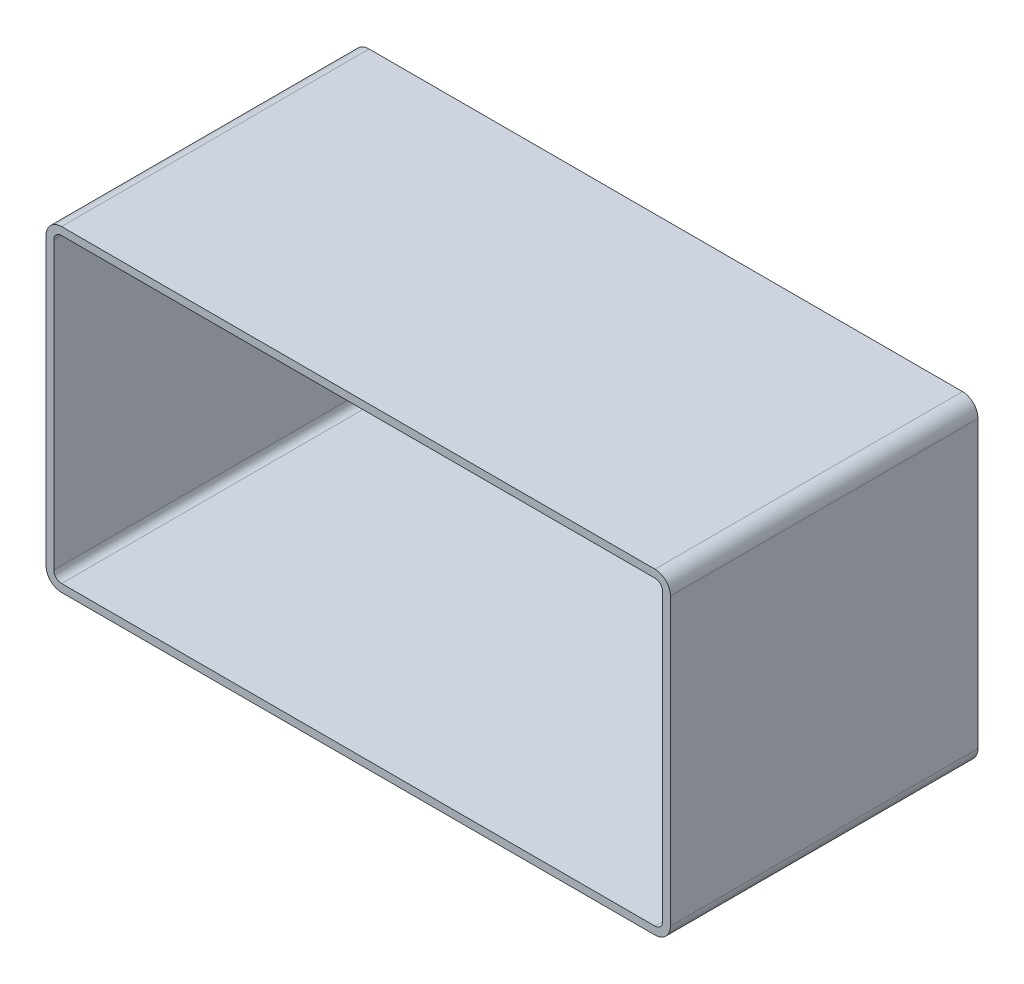
ISO-10303-21;
HEADER;
FILE_DESCRIPTION(('STEP AP214'),'2;1');
FILE_NAME('part.step','',(''),(''),'','','');
FILE_SCHEMA(('AUTOMOTIVE_DESIGN { 1 0 10303 214 1 1 1 1 }'));
ENDSEC;
DATA;
#1=APPLICATION_CONTEXT('core data for automotive mechanical design processes');
#2=APPLICATION_PROTOCOL_DEFINITION('international standard','automotive_design',2000,#1);
#3=PRODUCT_CONTEXT('',#1,'mechanical');
#4=PRODUCT('Part','Part','',(#3));
#5=PRODUCT_RELATED_PRODUCT_CATEGORY('part','',(#4));
#6=PRODUCT_DEFINITION_FORMATION('','',#4);
#7=PRODUCT_DEFINITION_CONTEXT('part definition',#1,'design');
#8=PRODUCT_DEFINITION('design','',#6,#7);
#9=PRODUCT_DEFINITION_SHAPE('','',#8);
#10=(LENGTH_UNIT() NAMED_UNIT(*) SI_UNIT(.MILLI.,.METRE.));
#11=(NAMED_UNIT(*) PLANE_ANGLE_UNIT() SI_UNIT($,.RADIAN.));
#12=(NAMED_UNIT(*) SI_UNIT($,.STERADIAN.) SOLID_ANGLE_UNIT());
#13=UNCERTAINTY_MEASURE_WITH_UNIT(LENGTH_MEASURE(1.E-05),#10,'distance_accuracy_value','');
#14=(GEOMETRIC_REPRESENTATION_CONTEXT(3) GLOBAL_UNCERTAINTY_ASSIGNED_CONTEXT((#13)) GLOBAL_UNIT_ASSIGNED_CONTEXT((#10,
#11,#12)) REPRESENTATION_CONTEXT('',''));
#15=CARTESIAN_POINT('',(0.,0.,0.));
#16=DIRECTION('',(0.,0.,1.));
#17=DIRECTION('',(1.,0.,0.));
#18=AXIS2_PLACEMENT_3D('',#15,#16,#17);
#19=CARTESIAN_POINT('',(-9.1,-9.2,-82.8799290150284));
#20=DIRECTION('',(0.,0.,1.));
#21=DIRECTION('',(1.,0.,0.));
#22=AXIS2_PLACEMENT_3D('',#19,#20,#21);
#23=CYLINDRICAL_SURFACE('',#22,0.999999999999999);
#24=DIRECTION('',(0.,0.,1.));
#25=VECTOR('',#24,1.);
#26=CARTESIAN_POINT('',(-10.1,-9.2,-82.8799290150284));
#27=LINE('',#26,#25);
#28=CARTESIAN_POINT('',(-10.1,-9.2,-37.7));
#29=VERTEX_POINT('',#28);
#30=CARTESIAN_POINT('',(-10.1,-9.2,-17.9));
#31=VERTEX_POINT('',#30);
#32=EDGE_CURVE('E132',#29,#31,#27,.T.);
#33=ORIENTED_EDGE('',*,*,#32,.F.);
#34=CARTESIAN_POINT('',(-9.1,-9.2,-37.7));
#35=DIRECTION('',(0.,0.,1.));
#36=DIRECTION('',(1.,0.,0.));
#37=AXIS2_PLACEMENT_3D('',#34,#35,#36);
#38=CIRCLE('',#37,0.999999999999999);
#39=CARTESIAN_POINT('',(-9.1,-10.2,-37.7));
#40=VERTEX_POINT('',#39);
#41=EDGE_CURVE('E137',#29,#40,#38,.T.);
#42=ORIENTED_EDGE('',*,*,#41,.T.);
#43=DIRECTION('',(0.,0.,1.));
#44=VECTOR('',#43,1.);
#45=CARTESIAN_POINT('',(-9.1,-10.2,-82.8799290150284));
#46=LINE('',#45,#44);
#47=CARTESIAN_POINT('',(-9.1,-10.2,-17.9));
#48=VERTEX_POINT('',#47);
#49=EDGE_CURVE('E135',#48,#40,#46,.F.);
#50=ORIENTED_EDGE('',*,*,#49,.F.);
#51=CARTESIAN_POINT('',(-9.1,-9.2,-17.9));
#52=DIRECTION('',(0.,0.,1.));
#53=DIRECTION('',(1.,0.,0.));
#54=AXIS2_PLACEMENT_3D('',#51,#52,#53);
#55=CIRCLE('',#54,0.999999999999999);
#56=EDGE_CURVE('E20',#48,#31,#55,.F.);
#57=ORIENTED_EDGE('',*,*,#56,.T.);
#58=EDGE_LOOP('',(#33,#42,#50,#57));
#59=FACE_BOUND('',#58,.T.);
#60=ADVANCED_FACE('F17',(#59),#23,.T.);
#61=CARTESIAN_POINT('',(29.1,-9.2,-82.8799290150284));
#62=DIRECTION('',(0.,0.,1.));
#63=DIRECTION('',(1.,0.,0.));
#64=AXIS2_PLACEMENT_3D('',#61,#62,#63);
#65=CYLINDRICAL_SURFACE('',#64,1.);
#66=DIRECTION('',(0.,0.,1.));
#67=VECTOR('',#66,1.);
#68=CARTESIAN_POINT('',(29.1,-10.2,-82.8799290150284));
#69=LINE('',#68,#67);
#70=CARTESIAN_POINT('',(29.1,-10.2,-37.7));
#71=VERTEX_POINT('',#70);
#72=CARTESIAN_POINT('',(29.1,-10.2,-17.9));
#73=VERTEX_POINT('',#72);
#74=EDGE_CURVE('E216',#71,#73,#69,.T.);
#75=ORIENTED_EDGE('',*,*,#74,.F.);
#76=CARTESIAN_POINT('',(29.1,-9.2,-37.7));
#77=DIRECTION('',(0.,0.,1.));
#78=DIRECTION('',(1.,0.,0.));
#79=AXIS2_PLACEMENT_3D('',#76,#77,#78);
#80=CIRCLE('',#79,1.);
#81=CARTESIAN_POINT('',(30.1,-9.2,-37.7));
#82=VERTEX_POINT('',#81);
#83=EDGE_CURVE('E245',#71,#82,#80,.T.);
#84=ORIENTED_EDGE('',*,*,#83,.T.);
#85=DIRECTION('',(0.,0.,-1.));
#86=VECTOR('',#85,1.);
#87=CARTESIAN_POINT('',(30.1,-9.2,-82.8799290150284));
#88=LINE('',#87,#86);
#89=CARTESIAN_POINT('',(30.1,-9.2,-17.9));
#90=VERTEX_POINT('',#89);
#91=EDGE_CURVE('E209',#90,#82,#88,.T.);
#92=ORIENTED_EDGE('',*,*,#91,.F.);
#93=CARTESIAN_POINT('',(29.1,-9.2,-17.9));
#94=DIRECTION('',(0.,0.,1.));
#95=DIRECTION('',(1.,0.,0.));
#96=AXIS2_PLACEMENT_3D('',#93,#94,#95);
#97=CIRCLE('',#96,1.);
#98=EDGE_CURVE('E247',#90,#73,#97,.F.);
#99=ORIENTED_EDGE('',*,*,#98,.T.);
#100=EDGE_LOOP('',(#75,#84,#92,#99));
#101=FACE_BOUND('',#100,.T.);
#102=ADVANCED_FACE('F257',(#101),#65,.T.);
#103=CARTESIAN_POINT('',(-9.1,9.2,-82.8799290150284));
#104=DIRECTION('',(0.,0.,1.));
#105=DIRECTION('',(1.,0.,0.));
#106=AXIS2_PLACEMENT_3D('',#103,#104,#105);
#107=CYLINDRICAL_SURFACE('',#106,0.999999999999999);
#108=DIRECTION('',(0.,0.,1.));
#109=VECTOR('',#108,1.);
#110=CARTESIAN_POINT('',(-9.1,10.2,-82.8799290150284));
#111=LINE('',#110,#109);
#112=CARTESIAN_POINT('',(-9.1,10.2,-37.7));
#113=VERTEX_POINT('',#112);
#114=CARTESIAN_POINT('',(-9.1,10.2,-17.9));
#115=VERTEX_POINT('',#114);
#116=EDGE_CURVE('E206',#113,#115,#111,.T.);
#117=ORIENTED_EDGE('',*,*,#116,.F.);
#118=CARTESIAN_POINT('',(-9.1,9.2,-37.7));
#119=DIRECTION('',(0.,0.,1.));
#120=DIRECTION('',(1.,0.,0.));
#121=AXIS2_PLACEMENT_3D('',#118,#119,#120);
#122=CIRCLE('',#121,0.999999999999999);
#123=CARTESIAN_POINT('',(-10.1,9.2,-37.7));
#124=VERTEX_POINT('',#123);
#125=EDGE_CURVE('E242',#113,#124,#122,.T.);
#126=ORIENTED_EDGE('',*,*,#125,.T.);
#127=DIRECTION('',(0.,0.,1.));
#128=VECTOR('',#127,1.);
#129=CARTESIAN_POINT('',(-10.1,9.2,-82.8799290150284));
#130=LINE('',#129,#128);
#131=CARTESIAN_POINT('',(-10.1,9.2,-17.9));
#132=VERTEX_POINT('',#131);
#133=EDGE_CURVE('E145',#132,#124,#130,.F.);
#134=ORIENTED_EDGE('',*,*,#133,.F.);
#135=CARTESIAN_POINT('',(-9.1,9.2,-17.9));
#136=DIRECTION('',(0.,0.,1.));
#137=DIRECTION('',(1.,0.,0.));
#138=AXIS2_PLACEMENT_3D('',#135,#136,#137);
#139=CIRCLE('',#138,0.999999999999999);
#140=EDGE_CURVE('E150',#132,#115,#139,.F.);
#141=ORIENTED_EDGE('',*,*,#140,.T.);
#142=EDGE_LOOP('',(#117,#126,#134,#141));
#143=FACE_BOUND('',#142,.T.);
#144=ADVANCED_FACE('F336',(#143),#107,.T.);
#145=CARTESIAN_POINT('',(29.1,9.2,-82.8799290150284));
#146=DIRECTION('',(0.,0.,1.));
#147=DIRECTION('',(1.,0.,0.));
#148=AXIS2_PLACEMENT_3D('',#145,#146,#147);
#149=CYLINDRICAL_SURFACE('',#148,1.);
#150=DIRECTION('',(0.,0.,-1.));
#151=VECTOR('',#150,1.);
#152=CARTESIAN_POINT('',(30.1,9.2,-82.8799290150284));
#153=LINE('',#152,#151);
#154=CARTESIAN_POINT('',(30.1,9.2,-37.7));
#155=VERTEX_POINT('',#154);
#156=CARTESIAN_POINT('',(30.1,9.2,-17.9));
#157=VERTEX_POINT('',#156);
#158=EDGE_CURVE('E212',#155,#157,#153,.F.);
#159=ORIENTED_EDGE('',*,*,#158,.F.);
#160=CARTESIAN_POINT('',(29.1,9.2,-37.7));
#161=DIRECTION('',(0.,0.,1.));
#162=DIRECTION('',(1.,0.,0.));
#163=AXIS2_PLACEMENT_3D('',#160,#161,#162);
#164=CIRCLE('',#163,1.);
#165=CARTESIAN_POINT('',(29.1,10.2,-37.7));
#166=VERTEX_POINT('',#165);
#167=EDGE_CURVE('E238',#155,#166,#164,.T.);
#168=ORIENTED_EDGE('',*,*,#167,.T.);
#169=DIRECTION('',(0.,0.,1.));
#170=VECTOR('',#169,1.);
#171=CARTESIAN_POINT('',(29.1,10.2,-82.8799290150284));
#172=LINE('',#171,#170);
#173=CARTESIAN_POINT('',(29.1,10.2,-17.9));
#174=VERTEX_POINT('',#173);
#175=EDGE_CURVE('E203',#174,#166,#172,.F.);
#176=ORIENTED_EDGE('',*,*,#175,.F.);
#177=CARTESIAN_POINT('',(29.1,9.2,-17.9));
#178=DIRECTION('',(0.,0.,1.));
#179=DIRECTION('',(1.,0.,0.));
#180=AXIS2_PLACEMENT_3D('',#177,#178,#179);
#181=CIRCLE('',#180,1.);
#182=EDGE_CURVE('E240',#174,#157,#181,.F.);
#183=ORIENTED_EDGE('',*,*,#182,.T.);
#184=EDGE_LOOP('',(#159,#168,#176,#183));
#185=FACE_BOUND('',#184,.T.);
#186=ADVANCED_FACE('F333',(#185),#149,.T.);
#187=CARTESIAN_POINT('',(29.1,9.2,-82.8799290150284));
#188=DIRECTION('',(0.,0.,1.));
#189=DIRECTION('',(1.,0.,0.));
#190=AXIS2_PLACEMENT_3D('',#187,#188,#189);
#191=CYLINDRICAL_SURFACE('',#190,0.5);
#192=CARTESIAN_POINT('',(29.1,9.2,-17.9));
#193=DIRECTION('',(0.,0.,1.));
#194=DIRECTION('',(1.,0.,0.));
#195=AXIS2_PLACEMENT_3D('',#192,#193,#194);
#196=CIRCLE('',#195,0.5);
#197=CARTESIAN_POINT('',(29.1,9.7,-17.9));
#198=VERTEX_POINT('',#197);
#199=CARTESIAN_POINT('',(29.6,9.2,-17.9));
#200=VERTEX_POINT('',#199);
#201=EDGE_CURVE('E234',#198,#200,#196,.F.);
#202=ORIENTED_EDGE('',*,*,#201,.F.);
#203=DIRECTION('',(0.,0.,1.));
#204=VECTOR('',#203,1.);
#205=CARTESIAN_POINT('',(29.1,9.7,-82.8799290150284));
#206=LINE('',#205,#204);
#207=CARTESIAN_POINT('',(29.1,9.7,-37.7));
#208=VERTEX_POINT('',#207);
#209=EDGE_CURVE('E195',#198,#208,#206,.F.);
#210=ORIENTED_EDGE('',*,*,#209,.T.);
#211=CARTESIAN_POINT('',(29.1,9.2,-37.7));
#212=DIRECTION('',(0.,0.,1.));
#213=DIRECTION('',(1.,0.,0.));
#214=AXIS2_PLACEMENT_3D('',#211,#212,#213);
#215=CIRCLE('',#214,0.5);
#216=CARTESIAN_POINT('',(29.6,9.2,-37.7));
#217=VERTEX_POINT('',#216);
#218=EDGE_CURVE('E236',#217,#208,#215,.T.);
#219=ORIENTED_EDGE('',*,*,#218,.F.);
#220=DIRECTION('',(0.,0.,-1.));
#221=VECTOR('',#220,1.);
#222=CARTESIAN_POINT('',(29.6,9.2,-82.8799290150284));
#223=LINE('',#222,#221);
#224=EDGE_CURVE('E196',#217,#200,#223,.F.);
#225=ORIENTED_EDGE('',*,*,#224,.T.);
#226=EDGE_LOOP('',(#202,#210,#219,#225));
#227=FACE_BOUND('',#226,.T.);
#228=ADVANCED_FACE('F278',(#227),#191,.F.);
#229=CARTESIAN_POINT('',(-9.1,9.2,-82.8799290150284));
#230=DIRECTION('',(0.,0.,1.));
#231=DIRECTION('',(1.,0.,0.));
#232=AXIS2_PLACEMENT_3D('',#229,#230,#231);
#233=CYLINDRICAL_SURFACE('',#232,0.499999999999999);
#234=CARTESIAN_POINT('',(-9.1,9.2,-17.9));
#235=DIRECTION('',(0.,0.,1.));
#236=DIRECTION('',(1.,0.,0.));
#237=AXIS2_PLACEMENT_3D('',#234,#235,#236);
#238=CIRCLE('',#237,0.499999999999999);
#239=CARTESIAN_POINT('',(-9.6,9.2,-17.9));
#240=VERTEX_POINT('',#239);
#241=CARTESIAN_POINT('',(-9.1,9.7,-17.9));
#242=VERTEX_POINT('',#241);
#243=EDGE_CURVE('E146',#240,#242,#238,.F.);
#244=ORIENTED_EDGE('',*,*,#243,.F.);
#245=DIRECTION('',(0.,0.,1.));
#246=VECTOR('',#245,1.);
#247=CARTESIAN_POINT('',(-9.6,9.2,-82.8799290150284));
#248=LINE('',#247,#246);
#249=CARTESIAN_POINT('',(-9.6,9.2,-37.7));
#250=VERTEX_POINT('',#249);
#251=EDGE_CURVE('E189',#240,#250,#248,.F.);
#252=ORIENTED_EDGE('',*,*,#251,.T.);
#253=CARTESIAN_POINT('',(-9.1,9.2,-37.7));
#254=DIRECTION('',(0.,0.,1.));
#255=DIRECTION('',(1.,0.,0.));
#256=AXIS2_PLACEMENT_3D('',#253,#254,#255);
#257=CIRCLE('',#256,0.499999999999999);
#258=CARTESIAN_POINT('',(-9.1,9.7,-37.7));
#259=VERTEX_POINT('',#258);
#260=EDGE_CURVE('E232',#259,#250,#257,.T.);
#261=ORIENTED_EDGE('',*,*,#260,.F.);
#262=DIRECTION('',(0.,0.,1.));
#263=VECTOR('',#262,1.);
#264=CARTESIAN_POINT('',(-9.1,9.7,-82.8799290150284));
#265=LINE('',#264,#263);
#266=EDGE_CURVE('E192',#259,#242,#265,.T.);
#267=ORIENTED_EDGE('',*,*,#266,.T.);
#268=EDGE_LOOP('',(#244,#252,#261,#267));
#269=FACE_BOUND('',#268,.T.);
#270=ADVANCED_FACE('F327',(#269),#233,.F.);
#271=CARTESIAN_POINT('',(-10.1,9.2,-82.8799290150284));
#272=DIRECTION('',(-1.,0.,0.));
#273=DIRECTION('',(0.,0.,1.));
#274=AXIS2_PLACEMENT_3D('',#271,#272,#273);
#275=PLANE('',#274);
#276=ORIENTED_EDGE('',*,*,#133,.T.);
#277=DIRECTION('',(0.,1.,0.));
#278=VECTOR('',#277,1.);
#279=CARTESIAN_POINT('',(-10.1,0.,-37.7));
#280=LINE('',#279,#278);
#281=EDGE_CURVE('E144',#29,#124,#280,.T.);
#282=ORIENTED_EDGE('',*,*,#281,.F.);
#283=ORIENTED_EDGE('',*,*,#32,.T.);
#284=DIRECTION('',(0.,1.,0.));
#285=VECTOR('',#284,1.);
#286=CARTESIAN_POINT('',(-10.1,9.2,-17.9));
#287=LINE('',#286,#285);
#288=EDGE_CURVE('E142',#132,#31,#287,.F.);
#289=ORIENTED_EDGE('',*,*,#288,.F.);
#290=EDGE_LOOP('',(#276,#282,#283,#289));
#291=FACE_BOUND('',#290,.T.);
#292=ADVANCED_FACE('F141',(#291),#275,.T.);
#293=CARTESIAN_POINT('',(-9.1,-10.2,-82.8799290150284));
#294=DIRECTION('',(0.,-1.,0.));
#295=DIRECTION('',(1.,0.,0.));
#296=AXIS2_PLACEMENT_3D('',#293,#294,#295);
#297=PLANE('',#296);
#298=ORIENTED_EDGE('',*,*,#49,.T.);
#299=DIRECTION('',(-1.,0.,0.));
#300=VECTOR('',#299,1.);
#301=CARTESIAN_POINT('',(10.,-10.2,-37.7));
#302=LINE('',#301,#300);
#303=EDGE_CURVE('E186',#71,#40,#302,.T.);
#304=ORIENTED_EDGE('',*,*,#303,.F.);
#305=ORIENTED_EDGE('',*,*,#74,.T.);
#306=DIRECTION('',(1.,0.,0.));
#307=VECTOR('',#306,1.);
#308=CARTESIAN_POINT('',(-9.1,-10.2,-17.9));
#309=LINE('',#308,#307);
#310=EDGE_CURVE('E152',#48,#73,#309,.T.);
#311=ORIENTED_EDGE('',*,*,#310,.F.);
#312=EDGE_LOOP('',(#298,#304,#305,#311));
#313=FACE_BOUND('',#312,.T.);
#314=ADVANCED_FACE('F251',(#313),#297,.T.);
#315=CARTESIAN_POINT('',(30.1,-9.2,-82.8799290150284));
#316=DIRECTION('',(1.,0.,0.));
#317=DIRECTION('',(0.,0.,-1.));
#318=AXIS2_PLACEMENT_3D('',#315,#316,#317);
#319=PLANE('',#318);
#320=ORIENTED_EDGE('',*,*,#91,.T.);
#321=DIRECTION('',(0.,1.,0.));
#322=VECTOR('',#321,1.);
#323=CARTESIAN_POINT('',(30.1,0.,-37.7));
#324=LINE('',#323,#322);
#325=EDGE_CURVE('E179',#155,#82,#324,.F.);
#326=ORIENTED_EDGE('',*,*,#325,.F.);
#327=ORIENTED_EDGE('',*,*,#158,.T.);
#328=DIRECTION('',(0.,1.,0.));
#329=VECTOR('',#328,1.);
#330=CARTESIAN_POINT('',(30.1,9.2,-17.9));
#331=LINE('',#330,#329);
#332=EDGE_CURVE('E155',#90,#157,#331,.T.);
#333=ORIENTED_EDGE('',*,*,#332,.F.);
#334=EDGE_LOOP('',(#320,#326,#327,#333));
#335=FACE_BOUND('',#334,.T.);
#336=ADVANCED_FACE('F261',(#335),#319,.T.);
#337=CARTESIAN_POINT('',(29.1,10.2,-82.8799290150284));
#338=DIRECTION('',(0.,1.,0.));
#339=DIRECTION('',(-1.,0.,0.));
#340=AXIS2_PLACEMENT_3D('',#337,#338,#339);
#341=PLANE('',#340);
#342=ORIENTED_EDGE('',*,*,#175,.T.);
#343=DIRECTION('',(-1.,0.,0.));
#344=VECTOR('',#343,1.);
#345=CARTESIAN_POINT('',(10.,10.2,-37.7));
#346=LINE('',#345,#344);
#347=EDGE_CURVE('E182',#113,#166,#346,.F.);
#348=ORIENTED_EDGE('',*,*,#347,.F.);
#349=ORIENTED_EDGE('',*,*,#116,.T.);
#350=DIRECTION('',(1.,0.,0.));
#351=VECTOR('',#350,1.);
#352=CARTESIAN_POINT('',(-9.1,10.2,-17.9));
#353=LINE('',#352,#351);
#354=EDGE_CURVE('E263',#174,#115,#353,.F.);
#355=ORIENTED_EDGE('',*,*,#354,.F.);
#356=EDGE_LOOP('',(#342,#348,#349,#355));
#357=FACE_BOUND('',#356,.T.);
#358=ADVANCED_FACE('F317',(#357),#341,.T.);
#359=CARTESIAN_POINT('',(29.6,-9.2,-82.8799290150284));
#360=DIRECTION('',(1.,0.,0.));
#361=DIRECTION('',(0.,0.,-1.));
#362=AXIS2_PLACEMENT_3D('',#359,#360,#361);
#363=PLANE('',#362);
#364=DIRECTION('',(0.,1.,0.));
#365=VECTOR('',#364,1.);
#366=CARTESIAN_POINT('',(29.6,9.2,-17.9));
#367=LINE('',#366,#365);
#368=CARTESIAN_POINT('',(29.6,-9.2,-17.9));
#369=VERTEX_POINT('',#368);
#370=EDGE_CURVE('E228',#200,#369,#367,.F.);
#371=ORIENTED_EDGE('',*,*,#370,.F.);
#372=ORIENTED_EDGE('',*,*,#224,.F.);
#373=DIRECTION('',(0.,1.,0.));
#374=VECTOR('',#373,1.);
#375=CARTESIAN_POINT('',(29.6,0.,-37.7));
#376=LINE('',#375,#374);
#377=CARTESIAN_POINT('',(29.6,-9.2,-37.7));
#378=VERTEX_POINT('',#377);
#379=EDGE_CURVE('E174',#378,#217,#376,.T.);
#380=ORIENTED_EDGE('',*,*,#379,.F.);
#381=DIRECTION('',(0.,0.,1.));
#382=VECTOR('',#381,1.);
#383=CARTESIAN_POINT('',(29.6,-9.2,-82.8799290150284));
#384=LINE('',#383,#382);
#385=EDGE_CURVE('E153',#378,#369,#384,.T.);
#386=ORIENTED_EDGE('',*,*,#385,.T.);
#387=EDGE_LOOP('',(#371,#372,#380,#386));
#388=FACE_BOUND('',#387,.T.);
#389=ADVANCED_FACE('F282',(#388),#363,.F.);
#390=CARTESIAN_POINT('',(29.1,9.7,-82.8799290150284));
#391=DIRECTION('',(0.,1.,0.));
#392=DIRECTION('',(-1.,0.,0.));
#393=AXIS2_PLACEMENT_3D('',#390,#391,#392);
#394=PLANE('',#393);
#395=DIRECTION('',(1.,0.,0.));
#396=VECTOR('',#395,1.);
#397=CARTESIAN_POINT('',(-9.1,9.7,-17.9));
#398=LINE('',#397,#396);
#399=EDGE_CURVE('E224',#242,#198,#398,.T.);
#400=ORIENTED_EDGE('',*,*,#399,.F.);
#401=ORIENTED_EDGE('',*,*,#266,.F.);
#402=DIRECTION('',(-1.,0.,0.));
#403=VECTOR('',#402,1.);
#404=CARTESIAN_POINT('',(10.,9.7,-37.7));
#405=LINE('',#404,#403);
#406=EDGE_CURVE('E171',#208,#259,#405,.T.);
#407=ORIENTED_EDGE('',*,*,#406,.F.);
#408=ORIENTED_EDGE('',*,*,#209,.F.);
#409=EDGE_LOOP('',(#400,#401,#407,#408));
#410=FACE_BOUND('',#409,.T.);
#411=ADVANCED_FACE('F275',(#410),#394,.F.);
#412=CARTESIAN_POINT('',(-9.6,9.2,-82.8799290150284));
#413=DIRECTION('',(-1.,0.,0.));
#414=DIRECTION('',(0.,0.,1.));
#415=AXIS2_PLACEMENT_3D('',#412,#413,#414);
#416=PLANE('',#415);
#417=DIRECTION('',(0.,1.,0.));
#418=VECTOR('',#417,1.);
#419=CARTESIAN_POINT('',(-9.6,9.2,-17.9));
#420=LINE('',#419,#418);
#421=CARTESIAN_POINT('',(-9.6,-9.2,-17.9));
#422=VERTEX_POINT('',#421);
#423=EDGE_CURVE('E227',#422,#240,#420,.T.);
#424=ORIENTED_EDGE('',*,*,#423,.F.);
#425=DIRECTION('',(0.,0.,1.));
#426=VECTOR('',#425,1.);
#427=CARTESIAN_POINT('',(-9.6,-9.2,-82.8799290150284));
#428=LINE('',#427,#426);
#429=CARTESIAN_POINT('',(-9.6,-9.2,-37.7));
#430=VERTEX_POINT('',#429);
#431=EDGE_CURVE('E170',#422,#430,#428,.F.);
#432=ORIENTED_EDGE('',*,*,#431,.T.);
#433=DIRECTION('',(0.,1.,0.));
#434=VECTOR('',#433,1.);
#435=CARTESIAN_POINT('',(-9.6,0.,-37.7));
#436=LINE('',#435,#434);
#437=EDGE_CURVE('E177',#250,#430,#436,.F.);
#438=ORIENTED_EDGE('',*,*,#437,.F.);
#439=ORIENTED_EDGE('',*,*,#251,.F.);
#440=EDGE_LOOP('',(#424,#432,#438,#439));
#441=FACE_BOUND('',#440,.T.);
#442=ADVANCED_FACE('F309',(#441),#416,.F.);
#443=CARTESIAN_POINT('',(10.,0.,-37.7));
#444=DIRECTION('',(0.,0.,-1.));
#445=DIRECTION('',(-1.,0.,0.));
#446=AXIS2_PLACEMENT_3D('',#443,#444,#445);
#447=PLANE('',#446);
#448=ORIENTED_EDGE('',*,*,#406,.T.);
#449=ORIENTED_EDGE('',*,*,#260,.T.);
#450=ORIENTED_EDGE('',*,*,#437,.T.);
#451=CARTESIAN_POINT('',(-9.1,-9.2,-37.7));
#452=DIRECTION('',(0.,0.,1.));
#453=DIRECTION('',(1.,0.,0.));
#454=AXIS2_PLACEMENT_3D('',#451,#452,#453);
#455=CIRCLE('',#454,0.499999999999999);
#456=CARTESIAN_POINT('',(-9.1,-9.7,-37.7));
#457=VERTEX_POINT('',#456);
#458=EDGE_CURVE('E221',#430,#457,#455,.T.);
#459=ORIENTED_EDGE('',*,*,#458,.T.);
#460=DIRECTION('',(1.,0.,0.));
#461=VECTOR('',#460,1.);
#462=CARTESIAN_POINT('',(-9.1,-9.7,-37.7));
#463=LINE('',#462,#461);
#464=CARTESIAN_POINT('',(29.1,-9.7,-37.7));
#465=VERTEX_POINT('',#464);
#466=EDGE_CURVE('E165',#457,#465,#463,.T.);
#467=ORIENTED_EDGE('',*,*,#466,.T.);
#468=CARTESIAN_POINT('',(29.1,-9.2,-37.7));
#469=DIRECTION('',(0.,0.,1.));
#470=DIRECTION('',(1.,0.,0.));
#471=AXIS2_PLACEMENT_3D('',#468,#469,#470);
#472=CIRCLE('',#471,0.5);
#473=EDGE_CURVE('E158',#465,#378,#472,.T.);
#474=ORIENTED_EDGE('',*,*,#473,.T.);
#475=ORIENTED_EDGE('',*,*,#379,.T.);
#476=ORIENTED_EDGE('',*,*,#218,.T.);
#477=EDGE_LOOP('',(#448,#449,#450,#459,#467,#474,#475,#476));
#478=FACE_BOUND('',#477,.T.);
#479=ORIENTED_EDGE('',*,*,#325,.T.);
#480=ORIENTED_EDGE('',*,*,#83,.F.);
#481=ORIENTED_EDGE('',*,*,#303,.T.);
#482=ORIENTED_EDGE('',*,*,#41,.F.);
#483=ORIENTED_EDGE('',*,*,#281,.T.);
#484=ORIENTED_EDGE('',*,*,#125,.F.);
#485=ORIENTED_EDGE('',*,*,#347,.T.);
#486=ORIENTED_EDGE('',*,*,#167,.F.);
#487=EDGE_LOOP('',(#479,#480,#481,#482,#483,#484,#485,#486));
#488=FACE_BOUND('',#487,.T.);
#489=ADVANCED_FACE('F252',(#478,#488),#447,.T.);
#490=CARTESIAN_POINT('',(29.1,-9.2,-82.8799290150284));
#491=DIRECTION('',(0.,0.,1.));
#492=DIRECTION('',(1.,0.,0.));
#493=AXIS2_PLACEMENT_3D('',#490,#491,#492);
#494=CYLINDRICAL_SURFACE('',#493,0.5);
#495=CARTESIAN_POINT('',(29.1,-9.2,-17.9));
#496=DIRECTION('',(0.,0.,1.));
#497=DIRECTION('',(1.,0.,0.));
#498=AXIS2_PLACEMENT_3D('',#495,#496,#497);
#499=CIRCLE('',#498,0.5);
#500=CARTESIAN_POINT('',(29.1,-9.7,-17.9));
#501=VERTEX_POINT('',#500);
#502=EDGE_CURVE('E225',#369,#501,#499,.F.);
#503=ORIENTED_EDGE('',*,*,#502,.F.);
#504=ORIENTED_EDGE('',*,*,#385,.F.);
#505=ORIENTED_EDGE('',*,*,#473,.F.);
#506=DIRECTION('',(0.,0.,1.));
#507=VECTOR('',#506,1.);
#508=CARTESIAN_POINT('',(29.1,-9.7,-82.8799290150284));
#509=LINE('',#508,#507);
#510=EDGE_CURVE('E162',#465,#501,#509,.T.);
#511=ORIENTED_EDGE('',*,*,#510,.T.);
#512=EDGE_LOOP('',(#503,#504,#505,#511));
#513=FACE_BOUND('',#512,.T.);
#514=ADVANCED_FACE('F290',(#513),#494,.F.);
#515=CARTESIAN_POINT('',(-9.1,9.2,-17.9));
#516=DIRECTION('',(0.,0.,1.));
#517=DIRECTION('',(1.,0.,0.));
#518=AXIS2_PLACEMENT_3D('',#515,#516,#517);
#519=PLANE('',#518);
#520=ORIENTED_EDGE('',*,*,#243,.T.);
#521=ORIENTED_EDGE('',*,*,#399,.T.);
#522=ORIENTED_EDGE('',*,*,#201,.T.);
#523=ORIENTED_EDGE('',*,*,#370,.T.);
#524=ORIENTED_EDGE('',*,*,#502,.T.);
#525=DIRECTION('',(1.,0.,0.));
#526=VECTOR('',#525,1.);
#527=CARTESIAN_POINT('',(-9.1,-9.7,-17.9));
#528=LINE('',#527,#526);
#529=CARTESIAN_POINT('',(-9.1,-9.7,-17.9));
#530=VERTEX_POINT('',#529);
#531=EDGE_CURVE('E26',#501,#530,#528,.F.);
#532=ORIENTED_EDGE('',*,*,#531,.T.);
#533=CARTESIAN_POINT('',(-9.1,-9.2,-17.9));
#534=DIRECTION('',(0.,0.,1.));
#535=DIRECTION('',(1.,0.,0.));
#536=AXIS2_PLACEMENT_3D('',#533,#534,#535);
#537=CIRCLE('',#536,0.499999999999999);
#538=EDGE_CURVE('E34',#530,#422,#537,.F.);
#539=ORIENTED_EDGE('',*,*,#538,.T.);
#540=ORIENTED_EDGE('',*,*,#423,.T.);
#541=EDGE_LOOP('',(#520,#521,#522,#523,#524,#532,#539,#540));
#542=FACE_BOUND('',#541,.T.);
#543=ORIENTED_EDGE('',*,*,#182,.F.);
#544=ORIENTED_EDGE('',*,*,#354,.T.);
#545=ORIENTED_EDGE('',*,*,#140,.F.);
#546=ORIENTED_EDGE('',*,*,#288,.T.);
#547=ORIENTED_EDGE('',*,*,#56,.F.);
#548=ORIENTED_EDGE('',*,*,#310,.T.);
#549=ORIENTED_EDGE('',*,*,#98,.F.);
#550=ORIENTED_EDGE('',*,*,#332,.T.);
#551=EDGE_LOOP('',(#543,#544,#545,#546,#547,#548,#549,#550));
#552=FACE_BOUND('',#551,.T.);
#553=ADVANCED_FACE('F148',(#542,#552),#519,.T.);
#554=CARTESIAN_POINT('',(-9.1,-9.2,-82.8799290150284));
#555=DIRECTION('',(0.,0.,1.));
#556=DIRECTION('',(1.,0.,0.));
#557=AXIS2_PLACEMENT_3D('',#554,#555,#556);
#558=CYLINDRICAL_SURFACE('',#557,0.499999999999999);
#559=ORIENTED_EDGE('',*,*,#538,.F.);
#560=DIRECTION('',(0.,0.,1.));
#561=VECTOR('',#560,1.);
#562=CARTESIAN_POINT('',(-9.1,-9.7,-82.8799290150284));
#563=LINE('',#562,#561);
#564=EDGE_CURVE('E11',#530,#457,#563,.F.);
#565=ORIENTED_EDGE('',*,*,#564,.T.);
#566=ORIENTED_EDGE('',*,*,#458,.F.);
#567=ORIENTED_EDGE('',*,*,#431,.F.);
#568=EDGE_LOOP('',(#559,#565,#566,#567));
#569=FACE_BOUND('',#568,.T.);
#570=ADVANCED_FACE('F294',(#569),#558,.F.);
#571=CARTESIAN_POINT('',(-9.1,-9.7,-82.8799290150284));
#572=DIRECTION('',(0.,-1.,0.));
#573=DIRECTION('',(1.,0.,0.));
#574=AXIS2_PLACEMENT_3D('',#571,#572,#573);
#575=PLANE('',#574);
#576=ORIENTED_EDGE('',*,*,#531,.F.);
#577=ORIENTED_EDGE('',*,*,#510,.F.);
#578=ORIENTED_EDGE('',*,*,#466,.F.);
#579=ORIENTED_EDGE('',*,*,#564,.F.);
#580=EDGE_LOOP('',(#576,#577,#578,#579));
#581=FACE_BOUND('',#580,.T.);
#582=ADVANCED_FACE('F289',(#581),#575,.F.);
#583=CLOSED_SHELL('',(#60,#102,#144,#186,#228,#270,#292,#314,#336,#358,#389,#411,#442,#489,#514,
#553,#570,#582));
#584=MANIFOLD_SOLID_BREP('B1',#583);
#585=ADVANCED_BREP_SHAPE_REPRESENTATION('',(#18,#584),#14);
#586=SHAPE_DEFINITION_REPRESENTATION(#9,#585);
ENDSEC;
END-ISO-10303-21;
